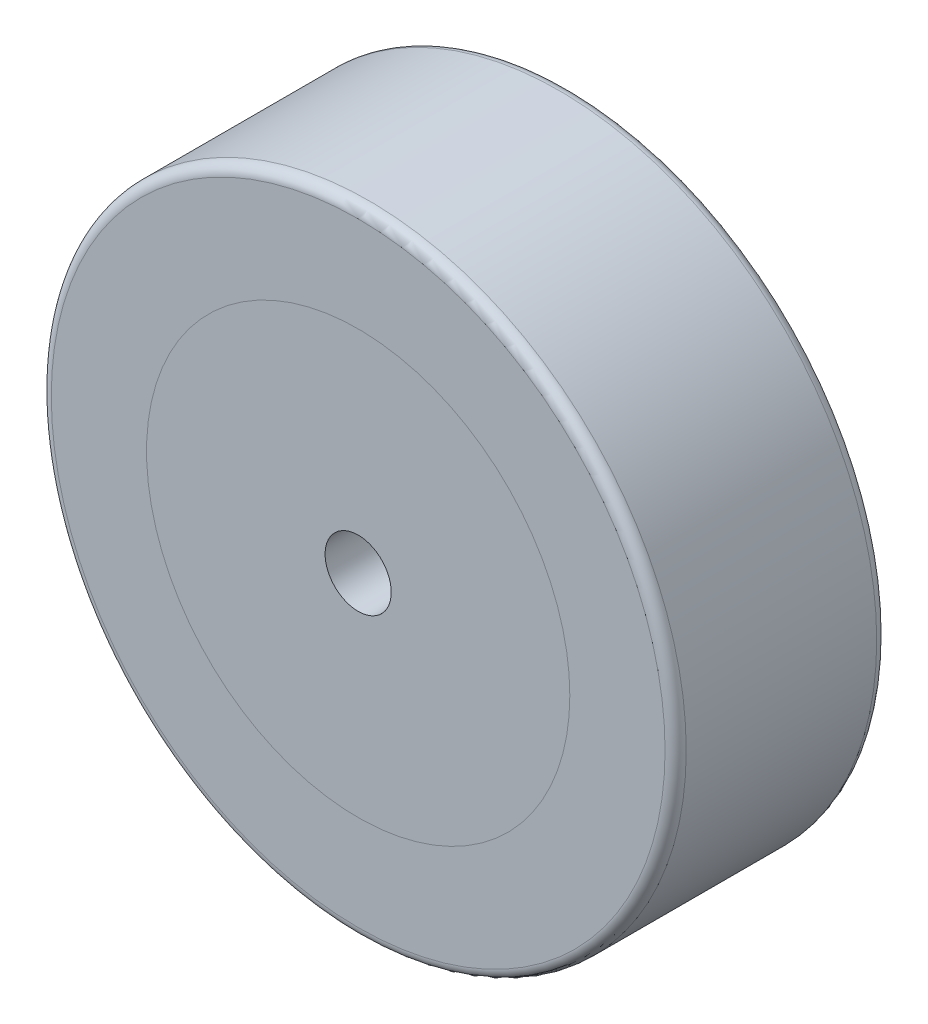
ISO-10303-21;
HEADER;
FILE_DESCRIPTION(('STEP AP214'),'2;1');
FILE_NAME('part.step','',(''),(''),'','','');
FILE_SCHEMA(('AUTOMOTIVE_DESIGN { 1 0 10303 214 1 1 1 1 }'));
ENDSEC;
DATA;
#1=APPLICATION_CONTEXT('core data for automotive mechanical design processes');
#2=APPLICATION_PROTOCOL_DEFINITION('international standard','automotive_design',2000,#1);
#3=PRODUCT_CONTEXT('',#1,'mechanical');
#4=PRODUCT('Part','Part','',(#3));
#5=PRODUCT_RELATED_PRODUCT_CATEGORY('part','',(#4));
#6=PRODUCT_DEFINITION_FORMATION('','',#4);
#7=PRODUCT_DEFINITION_CONTEXT('part definition',#1,'design');
#8=PRODUCT_DEFINITION('design','',#6,#7);
#9=PRODUCT_DEFINITION_SHAPE('','',#8);
#10=(LENGTH_UNIT() NAMED_UNIT(*) SI_UNIT(.MILLI.,.METRE.));
#11=(NAMED_UNIT(*) PLANE_ANGLE_UNIT() SI_UNIT($,.RADIAN.));
#12=(NAMED_UNIT(*) SI_UNIT($,.STERADIAN.) SOLID_ANGLE_UNIT());
#13=UNCERTAINTY_MEASURE_WITH_UNIT(LENGTH_MEASURE(1.E-05),#10,'distance_accuracy_value','');
#14=(GEOMETRIC_REPRESENTATION_CONTEXT(3) GLOBAL_UNCERTAINTY_ASSIGNED_CONTEXT((#13)) GLOBAL_UNIT_ASSIGNED_CONTEXT((#10,
#11,#12)) REPRESENTATION_CONTEXT('',''));
#15=CARTESIAN_POINT('',(0.,0.,0.));
#16=DIRECTION('',(0.,0.,1.));
#17=DIRECTION('',(1.,0.,0.));
#18=AXIS2_PLACEMENT_3D('',#15,#16,#17);
#19=CARTESIAN_POINT('',(0.,0.,266.32614690566));
#20=DIRECTION('',(0.,0.,-1.));
#21=DIRECTION('',(-1.,0.,0.));
#22=AXIS2_PLACEMENT_3D('',#19,#20,#21);
#23=CYLINDRICAL_SURFACE('',#22,76.2);
#24=CARTESIAN_POINT('',(0.,0.,2.53999999999999));
#25=DIRECTION('',(0.,0.,1.));
#26=DIRECTION('',(1.,0.,0.));
#27=AXIS2_PLACEMENT_3D('',#24,#25,#26);
#28=CIRCLE('',#27,76.2);
#29=CARTESIAN_POINT('',(76.2,0.,2.53999999999999));
#30=VERTEX_POINT('',#29);
#31=EDGE_CURVE('E52',#30,#30,#28,.T.);
#32=ORIENTED_EDGE('',*,*,#31,.T.);
#33=EDGE_LOOP('',(#32));
#34=FACE_BOUND('',#33,.T.);
#35=CARTESIAN_POINT('',(0.,0.,48.26));
#36=DIRECTION('',(0.,0.,1.));
#37=DIRECTION('',(1.,0.,0.));
#38=AXIS2_PLACEMENT_3D('',#35,#36,#37);
#39=CIRCLE('',#38,76.2);
#40=CARTESIAN_POINT('',(76.2,0.,48.26));
#41=VERTEX_POINT('',#40);
#42=EDGE_CURVE('E56',#41,#41,#39,.F.);
#43=ORIENTED_EDGE('',*,*,#42,.T.);
#44=EDGE_LOOP('',(#43));
#45=FACE_BOUND('',#44,.T.);
#46=ADVANCED_FACE('F41',(#34,#45),#23,.T.);
#47=CARTESIAN_POINT('',(0.,0.,0.));
#48=DIRECTION('',(0.,0.,1.));
#49=DIRECTION('',(1.,0.,0.));
#50=AXIS2_PLACEMENT_3D('',#47,#48,#49);
#51=PLANE('',#50);
#52=CARTESIAN_POINT('',(0.,0.,0.));
#53=DIRECTION('',(0.,0.,1.));
#54=DIRECTION('',(1.,0.,0.));
#55=AXIS2_PLACEMENT_3D('',#52,#53,#54);
#56=CIRCLE('',#55,73.66);
#57=CARTESIAN_POINT('',(73.66,0.,0.));
#58=VERTEX_POINT('',#57);
#59=EDGE_CURVE('E48',#58,#58,#56,.F.);
#60=ORIENTED_EDGE('',*,*,#59,.T.);
#61=EDGE_LOOP('',(#60));
#62=FACE_BOUND('',#61,.T.);
#63=CARTESIAN_POINT('',(0.,0.,0.));
#64=DIRECTION('',(0.,0.,1.));
#65=DIRECTION('',(1.,0.,0.));
#66=AXIS2_PLACEMENT_3D('',#63,#64,#65);
#67=CIRCLE('',#66,50.8);
#68=CARTESIAN_POINT('',(50.8,0.,0.));
#69=VERTEX_POINT('',#68);
#70=EDGE_CURVE('E61',#69,#69,#67,.T.);
#71=ORIENTED_EDGE('',*,*,#70,.T.);
#72=EDGE_LOOP('',(#71));
#73=FACE_BOUND('',#72,.T.);
#74=ADVANCED_FACE('F68',(#62,#73),#51,.F.);
#75=CARTESIAN_POINT('',(0.,0.,266.32614690566));
#76=DIRECTION('',(0.,0.,-1.));
#77=DIRECTION('',(-1.,0.,0.));
#78=AXIS2_PLACEMENT_3D('',#75,#76,#77);
#79=CYLINDRICAL_SURFACE('',#78,50.8);
#80=ORIENTED_EDGE('',*,*,#70,.F.);
#81=EDGE_LOOP('',(#80));
#82=FACE_BOUND('',#81,.T.);
#83=CARTESIAN_POINT('',(0.,0.,50.8));
#84=DIRECTION('',(0.,0.,1.));
#85=DIRECTION('',(1.,0.,0.));
#86=AXIS2_PLACEMENT_3D('',#83,#84,#85);
#87=CIRCLE('',#86,50.8);
#88=CARTESIAN_POINT('',(50.8,0.,50.8));
#89=VERTEX_POINT('',#88);
#90=EDGE_CURVE('E62',#89,#89,#87,.T.);
#91=ORIENTED_EDGE('',*,*,#90,.T.);
#92=EDGE_LOOP('',(#91));
#93=FACE_BOUND('',#92,.T.);
#94=ADVANCED_FACE('F70',(#82,#93),#79,.F.);
#95=CARTESIAN_POINT('',(0.,0.,50.8));
#96=DIRECTION('',(0.,0.,1.));
#97=DIRECTION('',(1.,0.,0.));
#98=AXIS2_PLACEMENT_3D('',#95,#96,#97);
#99=PLANE('',#98);
#100=CARTESIAN_POINT('',(0.,0.,50.8));
#101=DIRECTION('',(0.,0.,1.));
#102=DIRECTION('',(1.,0.,0.));
#103=AXIS2_PLACEMENT_3D('',#100,#101,#102);
#104=CIRCLE('',#103,73.66);
#105=CARTESIAN_POINT('',(73.66,0.,50.8));
#106=VERTEX_POINT('',#105);
#107=EDGE_CURVE('E11',#106,#106,#104,.T.);
#108=ORIENTED_EDGE('',*,*,#107,.T.);
#109=EDGE_LOOP('',(#108));
#110=FACE_BOUND('',#109,.T.);
#111=ORIENTED_EDGE('',*,*,#90,.F.);
#112=EDGE_LOOP('',(#111));
#113=FACE_BOUND('',#112,.T.);
#114=ADVANCED_FACE('F73',(#110,#113),#99,.T.);
#115=CARTESIAN_POINT('',(0.,0.,2.53999999999999));
#116=DIRECTION('',(0.,0.,1.));
#117=DIRECTION('',(1.,0.,0.));
#118=AXIS2_PLACEMENT_3D('',#115,#116,#117);
#119=TOROIDAL_SURFACE('',#118,73.66,2.54);
#120=ORIENTED_EDGE('',*,*,#59,.F.);
#121=EDGE_LOOP('',(#120));
#122=FACE_BOUND('',#121,.T.);
#123=ORIENTED_EDGE('',*,*,#31,.F.);
#124=EDGE_LOOP('',(#123));
#125=FACE_BOUND('',#124,.T.);
#126=ADVANCED_FACE('F78',(#122,#125),#119,.T.);
#127=CARTESIAN_POINT('',(0.,0.,48.26));
#128=DIRECTION('',(0.,0.,1.));
#129=DIRECTION('',(1.,0.,0.));
#130=AXIS2_PLACEMENT_3D('',#127,#128,#129);
#131=TOROIDAL_SURFACE('',#130,73.66,2.54);
#132=ORIENTED_EDGE('',*,*,#42,.F.);
#133=EDGE_LOOP('',(#132));
#134=FACE_BOUND('',#133,.T.);
#135=ORIENTED_EDGE('',*,*,#107,.F.);
#136=EDGE_LOOP('',(#135));
#137=FACE_BOUND('',#136,.T.);
#138=ADVANCED_FACE('F43',(#134,#137),#131,.T.);
#139=CLOSED_SHELL('',(#46,#74,#94,#114,#126,#138));
#140=MANIFOLD_SOLID_BREP('B2',#139);
#141=CARTESIAN_POINT('',(0.,0.,50.8));
#142=DIRECTION('',(0.,0.,-1.));
#143=DIRECTION('',(-1.,0.,0.));
#144=AXIS2_PLACEMENT_3D('',#141,#142,#143);
#145=CYLINDRICAL_SURFACE('',#144,50.8);
#146=CARTESIAN_POINT('',(0.,0.,50.8));
#147=DIRECTION('',(0.,0.,1.));
#148=DIRECTION('',(1.,0.,0.));
#149=AXIS2_PLACEMENT_3D('',#146,#147,#148);
#150=CIRCLE('',#149,50.8);
#151=CARTESIAN_POINT('',(50.8,0.,50.8));
#152=VERTEX_POINT('',#151);
#153=EDGE_CURVE('E40',#152,#152,#150,.T.);
#154=ORIENTED_EDGE('',*,*,#153,.F.);
#155=EDGE_LOOP('',(#154));
#156=FACE_BOUND('',#155,.T.);
#157=CARTESIAN_POINT('',(0.,0.,0.));
#158=DIRECTION('',(0.,0.,1.));
#159=DIRECTION('',(1.,0.,0.));
#160=AXIS2_PLACEMENT_3D('',#157,#158,#159);
#161=CIRCLE('',#160,50.8);
#162=CARTESIAN_POINT('',(50.8,0.,0.));
#163=VERTEX_POINT('',#162);
#164=EDGE_CURVE('E136',#163,#163,#161,.T.);
#165=ORIENTED_EDGE('',*,*,#164,.T.);
#166=EDGE_LOOP('',(#165));
#167=FACE_BOUND('',#166,.T.);
#168=ADVANCED_FACE('F133',(#156,#167),#145,.T.);
#169=CARTESIAN_POINT('',(0.,0.,50.8));
#170=DIRECTION('',(0.,0.,1.));
#171=DIRECTION('',(1.,0.,0.));
#172=AXIS2_PLACEMENT_3D('',#169,#170,#171);
#173=PLANE('',#172);
#174=CARTESIAN_POINT('',(0.,0.,50.8));
#175=DIRECTION('',(0.,0.,1.));
#176=DIRECTION('',(1.,0.,0.));
#177=AXIS2_PLACEMENT_3D('',#174,#175,#176);
#178=CIRCLE('',#177,7.9375);
#179=CARTESIAN_POINT('',(7.9375,0.,50.8));
#180=VERTEX_POINT('',#179);
#181=EDGE_CURVE('E143',#180,#180,#178,.T.);
#182=ORIENTED_EDGE('',*,*,#181,.F.);
#183=EDGE_LOOP('',(#182));
#184=FACE_BOUND('',#183,.T.);
#185=ORIENTED_EDGE('',*,*,#153,.T.);
#186=EDGE_LOOP('',(#185));
#187=FACE_BOUND('',#186,.T.);
#188=ADVANCED_FACE('F154',(#184,#187),#173,.T.);
#189=CARTESIAN_POINT('',(0.,0.,0.));
#190=DIRECTION('',(0.,0.,1.));
#191=DIRECTION('',(1.,0.,0.));
#192=AXIS2_PLACEMENT_3D('',#189,#190,#191);
#193=PLANE('',#192);
#194=CARTESIAN_POINT('',(0.,0.,0.));
#195=DIRECTION('',(0.,0.,1.));
#196=DIRECTION('',(1.,0.,0.));
#197=AXIS2_PLACEMENT_3D('',#194,#195,#196);
#198=CIRCLE('',#197,7.9375);
#199=CARTESIAN_POINT('',(7.9375,0.,0.));
#200=VERTEX_POINT('',#199);
#201=EDGE_CURVE('E145',#200,#200,#198,.T.);
#202=ORIENTED_EDGE('',*,*,#201,.T.);
#203=EDGE_LOOP('',(#202));
#204=FACE_BOUND('',#203,.T.);
#205=ORIENTED_EDGE('',*,*,#164,.F.);
#206=EDGE_LOOP('',(#205));
#207=FACE_BOUND('',#206,.T.);
#208=ADVANCED_FACE('F156',(#204,#207),#193,.F.);
#209=CARTESIAN_POINT('',(0.,0.,50.8));
#210=DIRECTION('',(0.,0.,-1.));
#211=DIRECTION('',(-1.,0.,0.));
#212=AXIS2_PLACEMENT_3D('',#209,#210,#211);
#213=CYLINDRICAL_SURFACE('',#212,7.9375);
#214=ORIENTED_EDGE('',*,*,#181,.T.);
#215=EDGE_LOOP('',(#214));
#216=FACE_BOUND('',#215,.T.);
#217=ORIENTED_EDGE('',*,*,#201,.F.);
#218=EDGE_LOOP('',(#217));
#219=FACE_BOUND('',#218,.T.);
#220=ADVANCED_FACE('F151',(#216,#219),#213,.F.);
#221=CLOSED_SHELL('',(#168,#188,#208,#220));
#222=MANIFOLD_SOLID_BREP('B6',#221);
#223=ADVANCED_BREP_SHAPE_REPRESENTATION('',(#18,#140,#222),#14);
#224=SHAPE_DEFINITION_REPRESENTATION(#9,#223);
ENDSEC;
END-ISO-10303-21;
